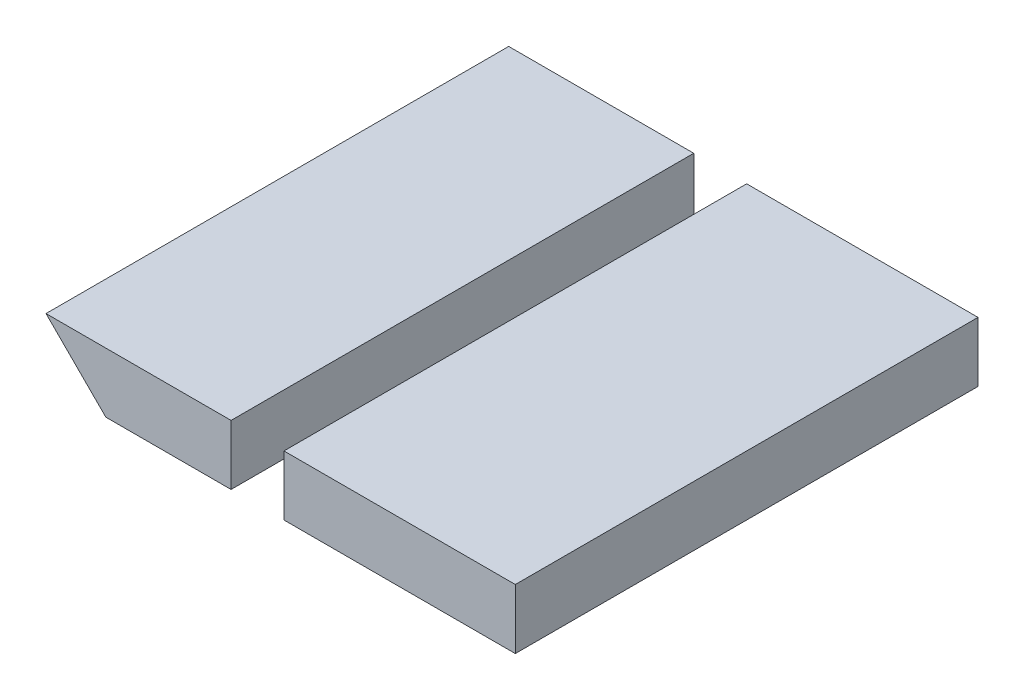
ISO-10303-21;
HEADER;
FILE_DESCRIPTION(('STEP AP214'),'2;1');
FILE_NAME('part.step','',(''),(''),'','','');
FILE_SCHEMA(('AUTOMOTIVE_DESIGN { 1 0 10303 214 1 1 1 1 }'));
ENDSEC;
DATA;
#1=APPLICATION_CONTEXT('core data for automotive mechanical design processes');
#2=APPLICATION_PROTOCOL_DEFINITION('international standard','automotive_design',2000,#1);
#3=PRODUCT_CONTEXT('',#1,'mechanical');
#4=PRODUCT('Part','Part','',(#3));
#5=PRODUCT_RELATED_PRODUCT_CATEGORY('part','',(#4));
#6=PRODUCT_DEFINITION_FORMATION('','',#4);
#7=PRODUCT_DEFINITION_CONTEXT('part definition',#1,'design');
#8=PRODUCT_DEFINITION('design','',#6,#7);
#9=PRODUCT_DEFINITION_SHAPE('','',#8);
#10=(LENGTH_UNIT() NAMED_UNIT(*) SI_UNIT(.MILLI.,.METRE.));
#11=(NAMED_UNIT(*) PLANE_ANGLE_UNIT() SI_UNIT($,.RADIAN.));
#12=(NAMED_UNIT(*) SI_UNIT($,.STERADIAN.) SOLID_ANGLE_UNIT());
#13=UNCERTAINTY_MEASURE_WITH_UNIT(LENGTH_MEASURE(1.E-05),#10,'distance_accuracy_value','');
#14=(GEOMETRIC_REPRESENTATION_CONTEXT(3) GLOBAL_UNCERTAINTY_ASSIGNED_CONTEXT((#13)) GLOBAL_UNIT_ASSIGNED_CONTEXT((#10,
#11,#12)) REPRESENTATION_CONTEXT('',''));
#15=CARTESIAN_POINT('',(0.,0.,0.));
#16=DIRECTION('',(0.,0.,1.));
#17=DIRECTION('',(1.,0.,0.));
#18=AXIS2_PLACEMENT_3D('',#15,#16,#17);
#19=CARTESIAN_POINT('',(5.,0.,20.));
#20=DIRECTION('',(1.,0.,0.));
#21=DIRECTION('',(0.,0.,-1.));
#22=AXIS2_PLACEMENT_3D('',#19,#20,#21);
#23=PLANE('',#22);
#24=DIRECTION('',(0.,-1.,0.));
#25=VECTOR('',#24,1.);
#26=CARTESIAN_POINT('',(5.,0.,0.));
#27=LINE('',#26,#25);
#28=CARTESIAN_POINT('',(5.,15.2861,0.));
#29=VERTEX_POINT('',#28);
#30=CARTESIAN_POINT('',(5.,12.7,0.));
#31=VERTEX_POINT('',#30);
#32=EDGE_CURVE('E122',#29,#31,#27,.T.);
#33=ORIENTED_EDGE('',*,*,#32,.F.);
#34=DIRECTION('',(0.,0.,-1.));
#35=VECTOR('',#34,1.);
#36=CARTESIAN_POINT('',(5.,15.2861,20.));
#37=LINE('',#36,#35);
#38=CARTESIAN_POINT('',(5.,15.2861,20.));
#39=VERTEX_POINT('',#38);
#40=EDGE_CURVE('E12',#39,#29,#37,.T.);
#41=ORIENTED_EDGE('',*,*,#40,.F.);
#42=DIRECTION('',(0.,-1.,0.));
#43=VECTOR('',#42,1.);
#44=CARTESIAN_POINT('',(5.,0.,20.));
#45=LINE('',#44,#43);
#46=CARTESIAN_POINT('',(5.,12.7,20.));
#47=VERTEX_POINT('',#46);
#48=EDGE_CURVE('E112',#39,#47,#45,.T.);
#49=ORIENTED_EDGE('',*,*,#48,.T.);
#50=DIRECTION('',(0.,0.,-1.));
#51=VECTOR('',#50,1.);
#52=CARTESIAN_POINT('',(5.,12.7,20.));
#53=LINE('',#52,#51);
#54=EDGE_CURVE('E93',#47,#31,#53,.T.);
#55=ORIENTED_EDGE('',*,*,#54,.T.);
#56=EDGE_LOOP('',(#33,#41,#49,#55));
#57=FACE_BOUND('',#56,.T.);
#58=ADVANCED_FACE('F54',(#57),#23,.T.);
#59=CARTESIAN_POINT('',(0.,15.2861,20.));
#60=DIRECTION('',(0.,1.,0.));
#61=DIRECTION('',(-1.,0.,0.));
#62=AXIS2_PLACEMENT_3D('',#59,#60,#61);
#63=PLANE('',#62);
#64=DIRECTION('',(1.,0.,0.));
#65=VECTOR('',#64,1.);
#66=CARTESIAN_POINT('',(0.,15.2861,0.));
#67=LINE('',#66,#65);
#68=CARTESIAN_POINT('',(-5.,15.2861,0.));
#69=VERTEX_POINT('',#68);
#70=EDGE_CURVE('E104',#69,#29,#67,.T.);
#71=ORIENTED_EDGE('',*,*,#70,.F.);
#72=DIRECTION('',(0.,0.,-1.));
#73=VECTOR('',#72,1.);
#74=CARTESIAN_POINT('',(-5.,15.2861,20.));
#75=LINE('',#74,#73);
#76=CARTESIAN_POINT('',(-5.,15.2861,20.));
#77=VERTEX_POINT('',#76);
#78=EDGE_CURVE('E63',#77,#69,#75,.T.);
#79=ORIENTED_EDGE('',*,*,#78,.F.);
#80=DIRECTION('',(1.,0.,0.));
#81=VECTOR('',#80,1.);
#82=CARTESIAN_POINT('',(0.,15.2861,20.));
#83=LINE('',#82,#81);
#84=EDGE_CURVE('E102',#77,#39,#83,.T.);
#85=ORIENTED_EDGE('',*,*,#84,.T.);
#86=ORIENTED_EDGE('',*,*,#40,.T.);
#87=EDGE_LOOP('',(#71,#79,#85,#86));
#88=FACE_BOUND('',#87,.T.);
#89=ADVANCED_FACE('F101',(#88),#63,.T.);
#90=CARTESIAN_POINT('',(-5.,0.,20.));
#91=DIRECTION('',(-1.,0.,0.));
#92=DIRECTION('',(0.,-1.,0.));
#93=AXIS2_PLACEMENT_3D('',#90,#91,#92);
#94=PLANE('',#93);
#95=DIRECTION('',(0.,1.,0.));
#96=VECTOR('',#95,1.);
#97=CARTESIAN_POINT('',(-5.,0.,0.));
#98=LINE('',#97,#96);
#99=CARTESIAN_POINT('',(-5.,12.7,0.));
#100=VERTEX_POINT('',#99);
#101=EDGE_CURVE('E128',#100,#69,#98,.T.);
#102=ORIENTED_EDGE('',*,*,#101,.F.);
#103=DIRECTION('',(0.,0.,-1.));
#104=VECTOR('',#103,1.);
#105=CARTESIAN_POINT('',(-5.,12.7,20.));
#106=LINE('',#105,#104);
#107=CARTESIAN_POINT('',(-5.,12.7,20.));
#108=VERTEX_POINT('',#107);
#109=EDGE_CURVE('E86',#108,#100,#106,.T.);
#110=ORIENTED_EDGE('',*,*,#109,.F.);
#111=DIRECTION('',(0.,1.,0.));
#112=VECTOR('',#111,1.);
#113=CARTESIAN_POINT('',(-5.,0.,20.));
#114=LINE('',#113,#112);
#115=EDGE_CURVE('E111',#108,#77,#114,.T.);
#116=ORIENTED_EDGE('',*,*,#115,.T.);
#117=ORIENTED_EDGE('',*,*,#78,.T.);
#118=EDGE_LOOP('',(#102,#110,#116,#117));
#119=FACE_BOUND('',#118,.T.);
#120=ADVANCED_FACE('F115',(#119),#94,.T.);
#121=CARTESIAN_POINT('',(0.,12.7,20.));
#122=DIRECTION('',(0.,1.,0.));
#123=DIRECTION('',(-1.,0.,0.));
#124=AXIS2_PLACEMENT_3D('',#121,#122,#123);
#125=PLANE('',#124);
#126=DIRECTION('',(1.,0.,0.));
#127=VECTOR('',#126,1.);
#128=CARTESIAN_POINT('',(0.,12.7,0.));
#129=LINE('',#128,#127);
#130=EDGE_CURVE('E131',#100,#31,#129,.T.);
#131=ORIENTED_EDGE('',*,*,#130,.T.);
#132=ORIENTED_EDGE('',*,*,#54,.F.);
#133=DIRECTION('',(1.,0.,0.));
#134=VECTOR('',#133,1.);
#135=CARTESIAN_POINT('',(0.,12.7,20.));
#136=LINE('',#135,#134);
#137=EDGE_CURVE('E71',#108,#47,#136,.T.);
#138=ORIENTED_EDGE('',*,*,#137,.F.);
#139=ORIENTED_EDGE('',*,*,#109,.T.);
#140=EDGE_LOOP('',(#131,#132,#138,#139));
#141=FACE_BOUND('',#140,.T.);
#142=ADVANCED_FACE('F145',(#141),#125,.F.);
#143=CARTESIAN_POINT('',(0.,0.,20.));
#144=DIRECTION('',(0.,0.,1.));
#145=DIRECTION('',(1.,0.,0.));
#146=AXIS2_PLACEMENT_3D('',#143,#144,#145);
#147=PLANE('',#146);
#148=ORIENTED_EDGE('',*,*,#48,.F.);
#149=ORIENTED_EDGE('',*,*,#84,.F.);
#150=ORIENTED_EDGE('',*,*,#115,.F.);
#151=ORIENTED_EDGE('',*,*,#137,.T.);
#152=EDGE_LOOP('',(#148,#149,#150,#151));
#153=FACE_BOUND('',#152,.T.);
#154=ADVANCED_FACE('F110',(#153),#147,.T.);
#155=CARTESIAN_POINT('',(0.,0.,0.));
#156=DIRECTION('',(0.,0.,1.));
#157=DIRECTION('',(1.,0.,0.));
#158=AXIS2_PLACEMENT_3D('',#155,#156,#157);
#159=PLANE('',#158);
#160=ORIENTED_EDGE('',*,*,#32,.T.);
#161=ORIENTED_EDGE('',*,*,#130,.F.);
#162=ORIENTED_EDGE('',*,*,#101,.T.);
#163=ORIENTED_EDGE('',*,*,#70,.T.);
#164=EDGE_LOOP('',(#160,#161,#162,#163));
#165=FACE_BOUND('',#164,.T.);
#166=ADVANCED_FACE('F150',(#165),#159,.F.);
#167=CLOSED_SHELL('',(#58,#89,#120,#142,#154,#166));
#168=MANIFOLD_SOLID_BREP('B2_NOT_SHOWN',#167);
#169=CARTESIAN_POINT('',(-7.28609999999999,0.,20.));
#170=DIRECTION('',(1.,0.,0.));
#171=DIRECTION('',(0.,1.,0.));
#172=AXIS2_PLACEMENT_3D('',#169,#170,#171);
#173=PLANE('',#172);
#174=DIRECTION('',(0.,-1.,0.));
#175=VECTOR('',#174,1.);
#176=CARTESIAN_POINT('',(-7.28609999999999,0.,0.));
#177=LINE('',#176,#175);
#178=CARTESIAN_POINT('',(-7.2861,15.2861,0.));
#179=VERTEX_POINT('',#178);
#180=CARTESIAN_POINT('',(-7.2861,12.7,0.));
#181=VERTEX_POINT('',#180);
#182=EDGE_CURVE('E255',#179,#181,#177,.T.);
#183=ORIENTED_EDGE('',*,*,#182,.F.);
#184=DIRECTION('',(0.,0.,-1.));
#185=VECTOR('',#184,1.);
#186=CARTESIAN_POINT('',(-7.2861,15.2861,20.));
#187=LINE('',#186,#185);
#188=CARTESIAN_POINT('',(-7.2861,15.2861,20.));
#189=VERTEX_POINT('',#188);
#190=EDGE_CURVE('E52',#189,#179,#187,.T.);
#191=ORIENTED_EDGE('',*,*,#190,.F.);
#192=DIRECTION('',(0.,-1.,0.));
#193=VECTOR('',#192,1.);
#194=CARTESIAN_POINT('',(-7.28609999999999,0.,20.));
#195=LINE('',#194,#193);
#196=CARTESIAN_POINT('',(-7.2861,12.7,20.));
#197=VERTEX_POINT('',#196);
#198=EDGE_CURVE('E249',#189,#197,#195,.T.);
#199=ORIENTED_EDGE('',*,*,#198,.T.);
#200=DIRECTION('',(0.,0.,-1.));
#201=VECTOR('',#200,1.);
#202=CARTESIAN_POINT('',(-7.2861,12.7,20.));
#203=LINE('',#202,#201);
#204=EDGE_CURVE('E230',#197,#181,#203,.T.);
#205=ORIENTED_EDGE('',*,*,#204,.T.);
#206=EDGE_LOOP('',(#183,#191,#199,#205));
#207=FACE_BOUND('',#206,.T.);
#208=ADVANCED_FACE('F192',(#207),#173,.T.);
#209=CARTESIAN_POINT('',(0.,15.2861,20.));
#210=DIRECTION('',(0.,1.,0.));
#211=DIRECTION('',(-1.,0.,0.));
#212=AXIS2_PLACEMENT_3D('',#209,#210,#211);
#213=PLANE('',#212);
#214=DIRECTION('',(1.,0.,0.));
#215=VECTOR('',#214,1.);
#216=CARTESIAN_POINT('',(0.,15.2861,0.));
#217=LINE('',#216,#215);
#218=CARTESIAN_POINT('',(-15.2861,15.2861,0.));
#219=VERTEX_POINT('',#218);
#220=EDGE_CURVE('E243',#219,#179,#217,.T.);
#221=ORIENTED_EDGE('',*,*,#220,.F.);
#222=DIRECTION('',(0.,0.,-1.));
#223=VECTOR('',#222,1.);
#224=CARTESIAN_POINT('',(-15.2861,15.2861,20.));
#225=LINE('',#224,#223);
#226=CARTESIAN_POINT('',(-15.2861,15.2861,20.));
#227=VERTEX_POINT('',#226);
#228=EDGE_CURVE('E200',#227,#219,#225,.T.);
#229=ORIENTED_EDGE('',*,*,#228,.F.);
#230=DIRECTION('',(1.,0.,0.));
#231=VECTOR('',#230,1.);
#232=CARTESIAN_POINT('',(0.,15.2861,20.));
#233=LINE('',#232,#231);
#234=EDGE_CURVE('E241',#227,#189,#233,.T.);
#235=ORIENTED_EDGE('',*,*,#234,.T.);
#236=ORIENTED_EDGE('',*,*,#190,.T.);
#237=EDGE_LOOP('',(#221,#229,#235,#236));
#238=FACE_BOUND('',#237,.T.);
#239=ADVANCED_FACE('F239',(#238),#213,.T.);
#240=CARTESIAN_POINT('',(0.,0.,20.));
#241=DIRECTION('',(0.707106781186547,0.707106781186548,0.));
#242=DIRECTION('',(-0.707106781186548,0.707106781186547,0.));
#243=AXIS2_PLACEMENT_3D('',#240,#241,#242);
#244=PLANE('',#243);
#245=DIRECTION('',(0.707106781186548,-0.707106781186547,0.));
#246=VECTOR('',#245,1.);
#247=CARTESIAN_POINT('',(0.,0.,0.));
#248=LINE('',#247,#246);
#249=CARTESIAN_POINT('',(-12.7,12.7,0.));
#250=VERTEX_POINT('',#249);
#251=EDGE_CURVE('E223',#219,#250,#248,.T.);
#252=ORIENTED_EDGE('',*,*,#251,.T.);
#253=DIRECTION('',(0.,0.,-1.));
#254=VECTOR('',#253,1.);
#255=CARTESIAN_POINT('',(-12.7,12.7,20.));
#256=LINE('',#255,#254);
#257=CARTESIAN_POINT('',(-12.7,12.7,20.));
#258=VERTEX_POINT('',#257);
#259=EDGE_CURVE('E244',#258,#250,#256,.T.);
#260=ORIENTED_EDGE('',*,*,#259,.F.);
#261=DIRECTION('',(0.707106781186548,-0.707106781186547,0.));
#262=VECTOR('',#261,1.);
#263=CARTESIAN_POINT('',(0.,0.,20.));
#264=LINE('',#263,#262);
#265=EDGE_CURVE('E245',#227,#258,#264,.T.);
#266=ORIENTED_EDGE('',*,*,#265,.F.);
#267=ORIENTED_EDGE('',*,*,#228,.T.);
#268=EDGE_LOOP('',(#252,#260,#266,#267));
#269=FACE_BOUND('',#268,.T.);
#270=ADVANCED_FACE('F246',(#269),#244,.F.);
#271=CARTESIAN_POINT('',(0.,12.7,20.));
#272=DIRECTION('',(0.,1.,0.));
#273=DIRECTION('',(-1.,0.,0.));
#274=AXIS2_PLACEMENT_3D('',#271,#272,#273);
#275=PLANE('',#274);
#276=DIRECTION('',(1.,0.,0.));
#277=VECTOR('',#276,1.);
#278=CARTESIAN_POINT('',(0.,12.7,0.));
#279=LINE('',#278,#277);
#280=EDGE_CURVE('E251',#250,#181,#279,.T.);
#281=ORIENTED_EDGE('',*,*,#280,.T.);
#282=ORIENTED_EDGE('',*,*,#204,.F.);
#283=DIRECTION('',(1.,0.,0.));
#284=VECTOR('',#283,1.);
#285=CARTESIAN_POINT('',(0.,12.7,20.));
#286=LINE('',#285,#284);
#287=EDGE_CURVE('E208',#258,#197,#286,.T.);
#288=ORIENTED_EDGE('',*,*,#287,.F.);
#289=ORIENTED_EDGE('',*,*,#259,.T.);
#290=EDGE_LOOP('',(#281,#282,#288,#289));
#291=FACE_BOUND('',#290,.T.);
#292=ADVANCED_FACE('F264',(#291),#275,.F.);
#293=CARTESIAN_POINT('',(0.,0.,20.));
#294=DIRECTION('',(0.,0.,1.));
#295=DIRECTION('',(1.,0.,0.));
#296=AXIS2_PLACEMENT_3D('',#293,#294,#295);
#297=PLANE('',#296);
#298=ORIENTED_EDGE('',*,*,#198,.F.);
#299=ORIENTED_EDGE('',*,*,#234,.F.);
#300=ORIENTED_EDGE('',*,*,#265,.T.);
#301=ORIENTED_EDGE('',*,*,#287,.T.);
#302=EDGE_LOOP('',(#298,#299,#300,#301));
#303=FACE_BOUND('',#302,.T.);
#304=ADVANCED_FACE('F248',(#303),#297,.T.);
#305=CARTESIAN_POINT('',(0.,0.,0.));
#306=DIRECTION('',(0.,0.,1.));
#307=DIRECTION('',(1.,0.,0.));
#308=AXIS2_PLACEMENT_3D('',#305,#306,#307);
#309=PLANE('',#308);
#310=ORIENTED_EDGE('',*,*,#182,.T.);
#311=ORIENTED_EDGE('',*,*,#280,.F.);
#312=ORIENTED_EDGE('',*,*,#251,.F.);
#313=ORIENTED_EDGE('',*,*,#220,.T.);
#314=EDGE_LOOP('',(#310,#311,#312,#313));
#315=FACE_BOUND('',#314,.T.);
#316=ADVANCED_FACE('F266',(#315),#309,.F.);
#317=CLOSED_SHELL('',(#208,#239,#270,#292,#304,#316));
#318=MANIFOLD_SOLID_BREP('B6',#317);
#319=ADVANCED_BREP_SHAPE_REPRESENTATION('',(#18,#168,#318),#14);
#320=SHAPE_DEFINITION_REPRESENTATION(#9,#319);
ENDSEC;
END-ISO-10303-21;
